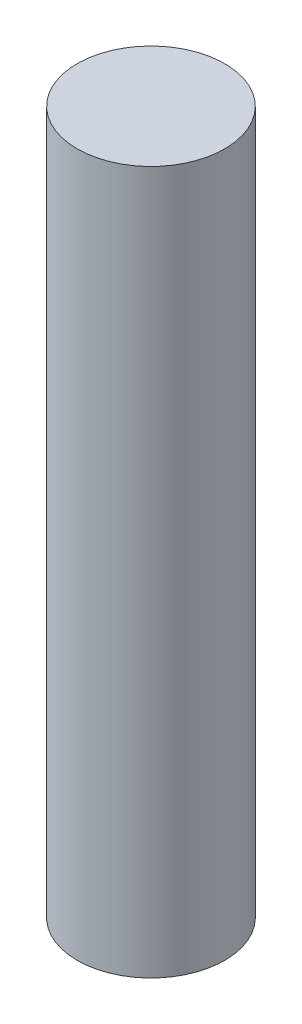
ISO-10303-21;
HEADER;
FILE_DESCRIPTION(('STEP AP214'),'2;1');
FILE_NAME('part.step','',(''),(''),'','','');
FILE_SCHEMA(('AUTOMOTIVE_DESIGN { 1 0 10303 214 1 1 1 1 }'));
ENDSEC;
DATA;
#1=APPLICATION_CONTEXT('core data for automotive mechanical design processes');
#2=APPLICATION_PROTOCOL_DEFINITION('international standard','automotive_design',2000,#1);
#3=PRODUCT_CONTEXT('',#1,'mechanical');
#4=PRODUCT('Part','Part','',(#3));
#5=PRODUCT_RELATED_PRODUCT_CATEGORY('part','',(#4));
#6=PRODUCT_DEFINITION_FORMATION('','',#4);
#7=PRODUCT_DEFINITION_CONTEXT('part definition',#1,'design');
#8=PRODUCT_DEFINITION('design','',#6,#7);
#9=PRODUCT_DEFINITION_SHAPE('','',#8);
#10=(LENGTH_UNIT() NAMED_UNIT(*) SI_UNIT(.MILLI.,.METRE.));
#11=(NAMED_UNIT(*) PLANE_ANGLE_UNIT() SI_UNIT($,.RADIAN.));
#12=(NAMED_UNIT(*) SI_UNIT($,.STERADIAN.) SOLID_ANGLE_UNIT());
#13=UNCERTAINTY_MEASURE_WITH_UNIT(LENGTH_MEASURE(1.E-05),#10,'distance_accuracy_value','');
#14=(GEOMETRIC_REPRESENTATION_CONTEXT(3) GLOBAL_UNCERTAINTY_ASSIGNED_CONTEXT((#13)) GLOBAL_UNIT_ASSIGNED_CONTEXT((#10,
#11,#12)) REPRESENTATION_CONTEXT('',''));
#15=CARTESIAN_POINT('',(0.,0.,0.));
#16=DIRECTION('',(0.,0.,1.));
#17=DIRECTION('',(1.,0.,0.));
#18=AXIS2_PLACEMENT_3D('',#15,#16,#17);
#19=CARTESIAN_POINT('',(0.,101.6,0.));
#20=DIRECTION('',(0.,-1.,0.));
#21=DIRECTION('',(0.,0.,-1.));
#22=AXIS2_PLACEMENT_3D('',#19,#20,#21);
#23=CYLINDRICAL_SURFACE('',#22,10.668);
#24=CARTESIAN_POINT('',(0.,101.6,0.));
#25=DIRECTION('',(0.,1.,0.));
#26=DIRECTION('',(0.,0.,1.));
#27=AXIS2_PLACEMENT_3D('',#24,#25,#26);
#28=CIRCLE('',#27,10.668);
#29=CARTESIAN_POINT('',(0.,101.6,10.668));
#30=VERTEX_POINT('',#29);
#31=EDGE_CURVE('E10',#30,#30,#28,.T.);
#32=ORIENTED_EDGE('',*,*,#31,.F.);
#33=EDGE_LOOP('',(#32));
#34=FACE_BOUND('',#33,.T.);
#35=CARTESIAN_POINT('',(0.,0.,0.));
#36=DIRECTION('',(0.,1.,0.));
#37=DIRECTION('',(0.,0.,1.));
#38=AXIS2_PLACEMENT_3D('',#35,#36,#37);
#39=CIRCLE('',#38,10.668);
#40=CARTESIAN_POINT('',(0.,0.,10.668));
#41=VERTEX_POINT('',#40);
#42=EDGE_CURVE('E33',#41,#41,#39,.T.);
#43=ORIENTED_EDGE('',*,*,#42,.T.);
#44=EDGE_LOOP('',(#43));
#45=FACE_BOUND('',#44,.T.);
#46=ADVANCED_FACE('F30',(#34,#45),#23,.T.);
#47=CARTESIAN_POINT('',(0.,101.6,0.));
#48=DIRECTION('',(0.,1.,0.));
#49=DIRECTION('',(0.,0.,1.));
#50=AXIS2_PLACEMENT_3D('',#47,#48,#49);
#51=PLANE('',#50);
#52=ORIENTED_EDGE('',*,*,#31,.T.);
#53=EDGE_LOOP('',(#52));
#54=FACE_BOUND('',#53,.T.);
#55=ADVANCED_FACE('F45',(#54),#51,.T.);
#56=CARTESIAN_POINT('',(0.,0.,0.));
#57=DIRECTION('',(0.,1.,0.));
#58=DIRECTION('',(0.,0.,1.));
#59=AXIS2_PLACEMENT_3D('',#56,#57,#58);
#60=PLANE('',#59);
#61=ORIENTED_EDGE('',*,*,#42,.F.);
#62=EDGE_LOOP('',(#61));
#63=FACE_BOUND('',#62,.T.);
#64=ADVANCED_FACE('F43',(#63),#60,.F.);
#65=CLOSED_SHELL('',(#46,#55,#64));
#66=MANIFOLD_SOLID_BREP('B2',#65);
#67=ADVANCED_BREP_SHAPE_REPRESENTATION('',(#18,#66),#14);
#68=SHAPE_DEFINITION_REPRESENTATION(#9,#67);
ENDSEC;
END-ISO-10303-21;
